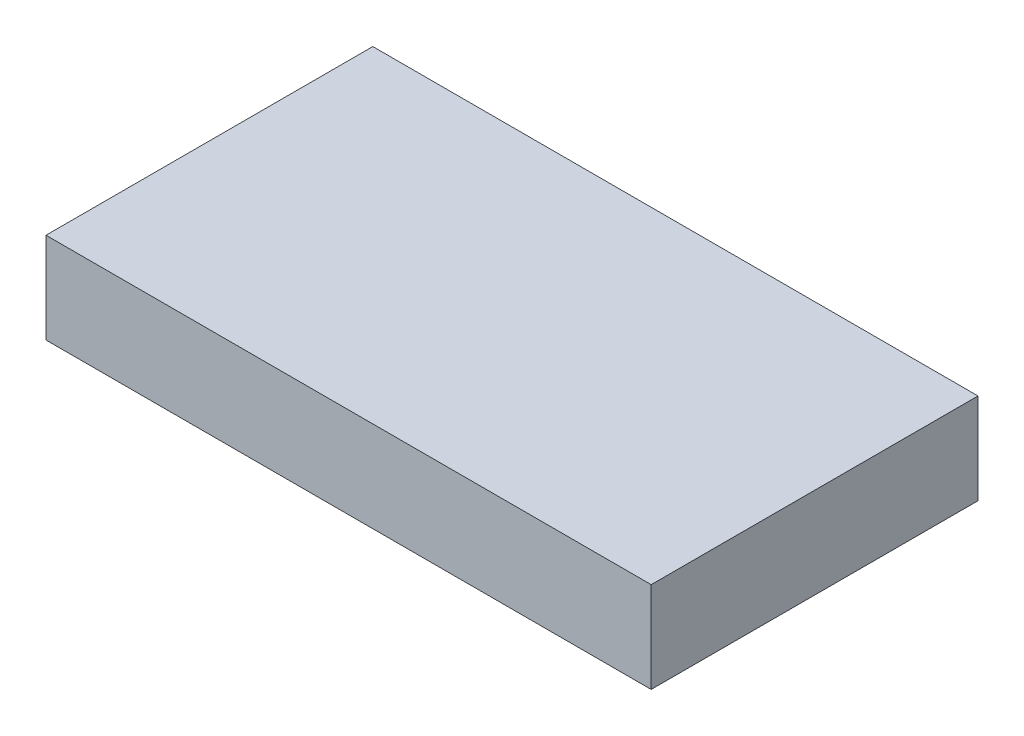
ISO-10303-21;
HEADER;
FILE_DESCRIPTION(('STEP AP214'),'2;1');
FILE_NAME('part.step','',(''),(''),'','','');
FILE_SCHEMA(('AUTOMOTIVE_DESIGN { 1 0 10303 214 1 1 1 1 }'));
ENDSEC;
DATA;
#1=APPLICATION_CONTEXT('core data for automotive mechanical design processes');
#2=APPLICATION_PROTOCOL_DEFINITION('international standard','automotive_design',2000,#1);
#3=PRODUCT_CONTEXT('',#1,'mechanical');
#4=PRODUCT('Part','Part','',(#3));
#5=PRODUCT_RELATED_PRODUCT_CATEGORY('part','',(#4));
#6=PRODUCT_DEFINITION_FORMATION('','',#4);
#7=PRODUCT_DEFINITION_CONTEXT('part definition',#1,'design');
#8=PRODUCT_DEFINITION('design','',#6,#7);
#9=PRODUCT_DEFINITION_SHAPE('','',#8);
#10=(LENGTH_UNIT() NAMED_UNIT(*) SI_UNIT(.MILLI.,.METRE.));
#11=(NAMED_UNIT(*) PLANE_ANGLE_UNIT() SI_UNIT($,.RADIAN.));
#12=(NAMED_UNIT(*) SI_UNIT($,.STERADIAN.) SOLID_ANGLE_UNIT());
#13=UNCERTAINTY_MEASURE_WITH_UNIT(LENGTH_MEASURE(1.E-05),#10,'distance_accuracy_value','');
#14=(GEOMETRIC_REPRESENTATION_CONTEXT(3) GLOBAL_UNCERTAINTY_ASSIGNED_CONTEXT((#13)) GLOBAL_UNIT_ASSIGNED_CONTEXT((#10,
#11,#12)) REPRESENTATION_CONTEXT('',''));
#15=CARTESIAN_POINT('',(0.,0.,0.));
#16=DIRECTION('',(0.,0.,1.));
#17=DIRECTION('',(1.,0.,0.));
#18=AXIS2_PLACEMENT_3D('',#15,#16,#17);
#19=CARTESIAN_POINT('',(-152.287460027278,19.05,-62.9944683532571));
#20=DIRECTION('',(1.,0.,0.));
#21=DIRECTION('',(0.,0.,-1.));
#22=AXIS2_PLACEMENT_3D('',#19,#20,#21);
#23=PLANE('',#22);
#24=DIRECTION('',(0.,0.,1.));
#25=VECTOR('',#24,1.);
#26=CARTESIAN_POINT('',(-152.287460027278,0.,-62.9944683532571));
#27=LINE('',#26,#25);
#28=CARTESIAN_POINT('',(-152.287460027278,0.,-62.9944683532571));
#29=VERTEX_POINT('',#28);
#30=CARTESIAN_POINT('',(-152.287460027278,0.,5.58553164674294));
#31=VERTEX_POINT('',#30);
#32=EDGE_CURVE('E99',#29,#31,#27,.T.);
#33=ORIENTED_EDGE('',*,*,#32,.T.);
#34=DIRECTION('',(0.,-1.,0.));
#35=VECTOR('',#34,1.);
#36=CARTESIAN_POINT('',(-152.287460027278,19.05,5.58553164674294));
#37=LINE('',#36,#35);
#38=CARTESIAN_POINT('',(-152.287460027278,19.05,5.58553164674294));
#39=VERTEX_POINT('',#38);
#40=EDGE_CURVE('E11',#39,#31,#37,.T.);
#41=ORIENTED_EDGE('',*,*,#40,.F.);
#42=DIRECTION('',(0.,0.,1.));
#43=VECTOR('',#42,1.);
#44=CARTESIAN_POINT('',(-152.287460027278,19.05,-62.9944683532571));
#45=LINE('',#44,#43);
#46=CARTESIAN_POINT('',(-152.287460027278,19.05,-62.9944683532571));
#47=VERTEX_POINT('',#46);
#48=EDGE_CURVE('E87',#47,#39,#45,.T.);
#49=ORIENTED_EDGE('',*,*,#48,.F.);
#50=DIRECTION('',(0.,-1.,0.));
#51=VECTOR('',#50,1.);
#52=CARTESIAN_POINT('',(-152.287460027278,19.05,-62.9944683532571));
#53=LINE('',#52,#51);
#54=EDGE_CURVE('E95',#47,#29,#53,.T.);
#55=ORIENTED_EDGE('',*,*,#54,.T.);
#56=EDGE_LOOP('',(#33,#41,#49,#55));
#57=FACE_BOUND('',#56,.T.);
#58=ADVANCED_FACE('F36',(#57),#23,.F.);
#59=CARTESIAN_POINT('',(-152.287460027278,19.05,5.58553164674294));
#60=DIRECTION('',(0.,0.,-1.));
#61=DIRECTION('',(-1.,0.,0.));
#62=AXIS2_PLACEMENT_3D('',#59,#60,#61);
#63=PLANE('',#62);
#64=DIRECTION('',(1.,0.,0.));
#65=VECTOR('',#64,1.);
#66=CARTESIAN_POINT('',(-152.287460027278,0.,5.58553164674294));
#67=LINE('',#66,#65);
#68=CARTESIAN_POINT('',(-25.2874600272781,0.,5.58553164674294));
#69=VERTEX_POINT('',#68);
#70=EDGE_CURVE('E91',#31,#69,#67,.T.);
#71=ORIENTED_EDGE('',*,*,#70,.T.);
#72=DIRECTION('',(0.,-1.,0.));
#73=VECTOR('',#72,1.);
#74=CARTESIAN_POINT('',(-25.2874600272781,19.05,5.58553164674294));
#75=LINE('',#74,#73);
#76=CARTESIAN_POINT('',(-25.2874600272781,19.05,5.58553164674294));
#77=VERTEX_POINT('',#76);
#78=EDGE_CURVE('E44',#77,#69,#75,.T.);
#79=ORIENTED_EDGE('',*,*,#78,.F.);
#80=DIRECTION('',(1.,0.,0.));
#81=VECTOR('',#80,1.);
#82=CARTESIAN_POINT('',(-152.287460027278,19.05,5.58553164674294));
#83=LINE('',#82,#81);
#84=EDGE_CURVE('E82',#39,#77,#83,.T.);
#85=ORIENTED_EDGE('',*,*,#84,.F.);
#86=ORIENTED_EDGE('',*,*,#40,.T.);
#87=EDGE_LOOP('',(#71,#79,#85,#86));
#88=FACE_BOUND('',#87,.T.);
#89=ADVANCED_FACE('F90',(#88),#63,.F.);
#90=CARTESIAN_POINT('',(-25.2874600272782,19.05,-62.9944683532571));
#91=DIRECTION('',(-1.,0.,0.));
#92=DIRECTION('',(0.,0.,1.));
#93=AXIS2_PLACEMENT_3D('',#90,#91,#92);
#94=PLANE('',#93);
#95=DIRECTION('',(0.,0.,-1.));
#96=VECTOR('',#95,1.);
#97=CARTESIAN_POINT('',(-25.2874600272782,0.,-62.9944683532571));
#98=LINE('',#97,#96);
#99=CARTESIAN_POINT('',(-25.2874600272782,0.,-62.9944683532571));
#100=VERTEX_POINT('',#99);
#101=EDGE_CURVE('E69',#69,#100,#98,.T.);
#102=ORIENTED_EDGE('',*,*,#101,.T.);
#103=DIRECTION('',(0.,-1.,0.));
#104=VECTOR('',#103,1.);
#105=CARTESIAN_POINT('',(-25.2874600272782,19.05,-62.9944683532571));
#106=LINE('',#105,#104);
#107=CARTESIAN_POINT('',(-25.2874600272782,19.05,-62.9944683532571));
#108=VERTEX_POINT('',#107);
#109=EDGE_CURVE('E92',#108,#100,#106,.T.);
#110=ORIENTED_EDGE('',*,*,#109,.F.);
#111=DIRECTION('',(0.,0.,-1.));
#112=VECTOR('',#111,1.);
#113=CARTESIAN_POINT('',(-25.2874600272782,19.05,-62.9944683532571));
#114=LINE('',#113,#112);
#115=EDGE_CURVE('E85',#77,#108,#114,.T.);
#116=ORIENTED_EDGE('',*,*,#115,.F.);
#117=ORIENTED_EDGE('',*,*,#78,.T.);
#118=EDGE_LOOP('',(#102,#110,#116,#117));
#119=FACE_BOUND('',#118,.T.);
#120=ADVANCED_FACE('F93',(#119),#94,.F.);
#121=CARTESIAN_POINT('',(-152.287460027278,19.05,-62.9944683532571));
#122=DIRECTION('',(0.,0.,1.));
#123=DIRECTION('',(1.,0.,0.));
#124=AXIS2_PLACEMENT_3D('',#121,#122,#123);
#125=PLANE('',#124);
#126=DIRECTION('',(-1.,0.,0.));
#127=VECTOR('',#126,1.);
#128=CARTESIAN_POINT('',(-152.287460027278,0.,-62.9944683532571));
#129=LINE('',#128,#127);
#130=EDGE_CURVE('E75',#100,#29,#129,.T.);
#131=ORIENTED_EDGE('',*,*,#130,.T.);
#132=ORIENTED_EDGE('',*,*,#54,.F.);
#133=DIRECTION('',(-1.,0.,0.));
#134=VECTOR('',#133,1.);
#135=CARTESIAN_POINT('',(-152.287460027278,19.05,-62.9944683532571));
#136=LINE('',#135,#134);
#137=EDGE_CURVE('E52',#108,#47,#136,.T.);
#138=ORIENTED_EDGE('',*,*,#137,.F.);
#139=ORIENTED_EDGE('',*,*,#109,.T.);
#140=EDGE_LOOP('',(#131,#132,#138,#139));
#141=FACE_BOUND('',#140,.T.);
#142=ADVANCED_FACE('F106',(#141),#125,.F.);
#143=CARTESIAN_POINT('',(-152.287460027278,19.05,5.58553164674294));
#144=DIRECTION('',(0.,1.,0.));
#145=DIRECTION('',(0.,0.,1.));
#146=AXIS2_PLACEMENT_3D('',#143,#144,#145);
#147=PLANE('',#146);
#148=ORIENTED_EDGE('',*,*,#48,.T.);
#149=ORIENTED_EDGE('',*,*,#84,.T.);
#150=ORIENTED_EDGE('',*,*,#115,.T.);
#151=ORIENTED_EDGE('',*,*,#137,.T.);
#152=EDGE_LOOP('',(#148,#149,#150,#151));
#153=FACE_BOUND('',#152,.T.);
#154=ADVANCED_FACE('F83',(#153),#147,.T.);
#155=CARTESIAN_POINT('',(-152.287460027278,0.,5.58553164674294));
#156=DIRECTION('',(0.,1.,0.));
#157=DIRECTION('',(0.,0.,1.));
#158=AXIS2_PLACEMENT_3D('',#155,#156,#157);
#159=PLANE('',#158);
#160=ORIENTED_EDGE('',*,*,#32,.F.);
#161=ORIENTED_EDGE('',*,*,#130,.F.);
#162=ORIENTED_EDGE('',*,*,#101,.F.);
#163=ORIENTED_EDGE('',*,*,#70,.F.);
#164=EDGE_LOOP('',(#160,#161,#162,#163));
#165=FACE_BOUND('',#164,.T.);
#166=ADVANCED_FACE('F109',(#165),#159,.F.);
#167=CLOSED_SHELL('',(#58,#89,#120,#142,#154,#166));
#168=MANIFOLD_SOLID_BREP('B2',#167);
#169=ADVANCED_BREP_SHAPE_REPRESENTATION('',(#18,#168),#14);
#170=SHAPE_DEFINITION_REPRESENTATION(#9,#169);
ENDSEC;
END-ISO-10303-21;
